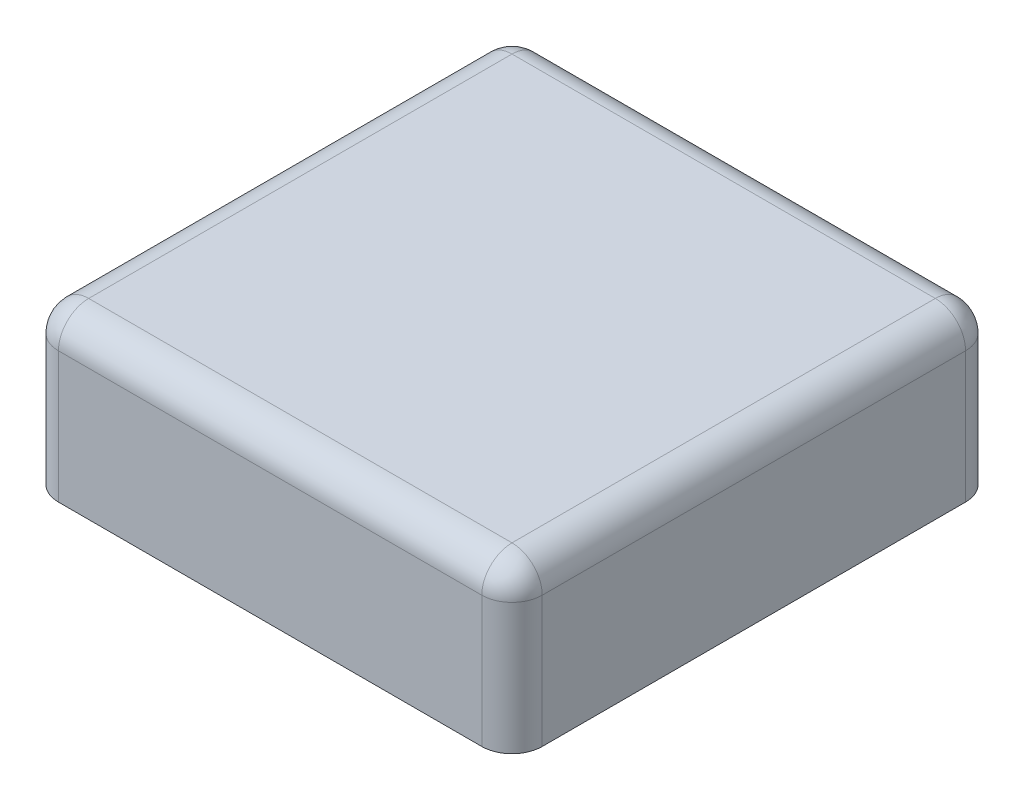
ISO-10303-21;
HEADER;
FILE_DESCRIPTION(('STEP AP214'),'2;1');
FILE_NAME('part.step','',(''),(''),'','','');
FILE_SCHEMA(('AUTOMOTIVE_DESIGN { 1 0 10303 214 1 1 1 1 }'));
ENDSEC;
DATA;
#1=APPLICATION_CONTEXT('core data for automotive mechanical design processes');
#2=APPLICATION_PROTOCOL_DEFINITION('international standard','automotive_design',2000,#1);
#3=PRODUCT_CONTEXT('',#1,'mechanical');
#4=PRODUCT('Part','Part','',(#3));
#5=PRODUCT_RELATED_PRODUCT_CATEGORY('part','',(#4));
#6=PRODUCT_DEFINITION_FORMATION('','',#4);
#7=PRODUCT_DEFINITION_CONTEXT('part definition',#1,'design');
#8=PRODUCT_DEFINITION('design','',#6,#7);
#9=PRODUCT_DEFINITION_SHAPE('','',#8);
#10=(LENGTH_UNIT() NAMED_UNIT(*) SI_UNIT(.MILLI.,.METRE.));
#11=(NAMED_UNIT(*) PLANE_ANGLE_UNIT() SI_UNIT($,.RADIAN.));
#12=(NAMED_UNIT(*) SI_UNIT($,.STERADIAN.) SOLID_ANGLE_UNIT());
#13=UNCERTAINTY_MEASURE_WITH_UNIT(LENGTH_MEASURE(1.E-05),#10,'distance_accuracy_value','');
#14=(GEOMETRIC_REPRESENTATION_CONTEXT(3) GLOBAL_UNCERTAINTY_ASSIGNED_CONTEXT((#13)) GLOBAL_UNIT_ASSIGNED_CONTEXT((#10,
#11,#12)) REPRESENTATION_CONTEXT('',''));
#15=CARTESIAN_POINT('',(0.,0.,0.));
#16=DIRECTION('',(0.,0.,1.));
#17=DIRECTION('',(1.,0.,0.));
#18=AXIS2_PLACEMENT_3D('',#15,#16,#17);
#19=CARTESIAN_POINT('',(-10.1341548762552,4.,-10.2951004081671));
#20=DIRECTION('',(1.,0.,0.));
#21=DIRECTION('',(0.,0.,-1.));
#22=AXIS2_PLACEMENT_3D('',#19,#20,#21);
#23=PLANE('',#22);
#24=DIRECTION('',(0.,0.,1.));
#25=VECTOR('',#24,1.);
#26=CARTESIAN_POINT('',(-10.1341548762552,0.,-10.2951004081671));
#27=LINE('',#26,#25);
#28=CARTESIAN_POINT('',(-10.1341548762552,0.,-9.54510040816707));
#29=VERTEX_POINT('',#28);
#30=CARTESIAN_POINT('',(-10.1341548762552,0.,0.954899591832928));
#31=VERTEX_POINT('',#30);
#32=EDGE_CURVE('E139',#29,#31,#27,.T.);
#33=ORIENTED_EDGE('',*,*,#32,.T.);
#34=DIRECTION('',(0.,-1.,0.));
#35=VECTOR('',#34,1.);
#36=CARTESIAN_POINT('',(-10.1341548762552,4.,0.954899591832928));
#37=LINE('',#36,#35);
#38=CARTESIAN_POINT('',(-10.1341548762552,3.25,0.954899591832929));
#39=VERTEX_POINT('',#38);
#40=EDGE_CURVE('E117',#31,#39,#37,.F.);
#41=ORIENTED_EDGE('',*,*,#40,.T.);
#42=DIRECTION('',(0.,0.,1.));
#43=VECTOR('',#42,1.);
#44=CARTESIAN_POINT('',(-10.1341548762552,3.25,-10.2951004081671));
#45=LINE('',#44,#43);
#46=CARTESIAN_POINT('',(-10.1341548762552,3.25,-9.54510040816707));
#47=VERTEX_POINT('',#46);
#48=EDGE_CURVE('E122',#39,#47,#45,.F.);
#49=ORIENTED_EDGE('',*,*,#48,.T.);
#50=DIRECTION('',(0.,-1.,0.));
#51=VECTOR('',#50,1.);
#52=CARTESIAN_POINT('',(-10.1341548762552,4.,-9.54510040816707));
#53=LINE('',#52,#51);
#54=EDGE_CURVE('E155',#47,#29,#53,.T.);
#55=ORIENTED_EDGE('',*,*,#54,.T.);
#56=EDGE_LOOP('',(#33,#41,#49,#55));
#57=FACE_BOUND('',#56,.T.);
#58=ADVANCED_FACE('F32',(#57),#23,.F.);
#59=CARTESIAN_POINT('',(-10.1341548762552,4.,1.70489959183293));
#60=DIRECTION('',(0.,0.,-1.));
#61=DIRECTION('',(-1.,0.,0.));
#62=AXIS2_PLACEMENT_3D('',#59,#60,#61);
#63=PLANE('',#62);
#64=DIRECTION('',(1.,0.,0.));
#65=VECTOR('',#64,1.);
#66=CARTESIAN_POINT('',(-10.1341548762552,3.25,1.70489959183293));
#67=LINE('',#66,#65);
#68=CARTESIAN_POINT('',(1.11584512374479,3.25,1.70489959183293));
#69=VERTEX_POINT('',#68);
#70=CARTESIAN_POINT('',(-9.38415487625521,3.25,1.70489959183293));
#71=VERTEX_POINT('',#70);
#72=EDGE_CURVE('E130',#69,#71,#67,.F.);
#73=ORIENTED_EDGE('',*,*,#72,.T.);
#74=DIRECTION('',(0.,-1.,0.));
#75=VECTOR('',#74,1.);
#76=CARTESIAN_POINT('',(-9.38415487625521,4.,1.70489959183293));
#77=LINE('',#76,#75);
#78=CARTESIAN_POINT('',(-9.38415487625521,0.,1.70489959183293));
#79=VERTEX_POINT('',#78);
#80=EDGE_CURVE('E116',#71,#79,#77,.T.);
#81=ORIENTED_EDGE('',*,*,#80,.T.);
#82=DIRECTION('',(1.,0.,0.));
#83=VECTOR('',#82,1.);
#84=CARTESIAN_POINT('',(-10.1341548762552,0.,1.70489959183293));
#85=LINE('',#84,#83);
#86=CARTESIAN_POINT('',(1.11584512374479,0.,1.70489959183293));
#87=VERTEX_POINT('',#86);
#88=EDGE_CURVE('E128',#79,#87,#85,.T.);
#89=ORIENTED_EDGE('',*,*,#88,.T.);
#90=DIRECTION('',(0.,-1.,0.));
#91=VECTOR('',#90,1.);
#92=CARTESIAN_POINT('',(1.11584512374479,4.,1.70489959183293));
#93=LINE('',#92,#91);
#94=EDGE_CURVE('E133',#87,#69,#93,.F.);
#95=ORIENTED_EDGE('',*,*,#94,.T.);
#96=EDGE_LOOP('',(#73,#81,#89,#95));
#97=FACE_BOUND('',#96,.T.);
#98=ADVANCED_FACE('F127',(#97),#63,.F.);
#99=CARTESIAN_POINT('',(1.86584512374478,4.,-10.2951004081671));
#100=DIRECTION('',(-1.,0.,0.));
#101=DIRECTION('',(0.,0.,1.));
#102=AXIS2_PLACEMENT_3D('',#99,#100,#101);
#103=PLANE('',#102);
#104=DIRECTION('',(0.,0.,-1.));
#105=VECTOR('',#104,1.);
#106=CARTESIAN_POINT('',(1.86584512374478,0.,-10.2951004081671));
#107=LINE('',#106,#105);
#108=CARTESIAN_POINT('',(1.86584512374479,0.,0.954899591832928));
#109=VERTEX_POINT('',#108);
#110=CARTESIAN_POINT('',(1.86584512374479,0.,-9.54510040816707));
#111=VERTEX_POINT('',#110);
#112=EDGE_CURVE('E138',#109,#111,#107,.T.);
#113=ORIENTED_EDGE('',*,*,#112,.T.);
#114=DIRECTION('',(0.,-1.,0.));
#115=VECTOR('',#114,1.);
#116=CARTESIAN_POINT('',(1.86584512374479,4.,-9.54510040816707));
#117=LINE('',#116,#115);
#118=CARTESIAN_POINT('',(1.86584512374479,3.25,-9.54510040816707));
#119=VERTEX_POINT('',#118);
#120=EDGE_CURVE('E168',#111,#119,#117,.F.);
#121=ORIENTED_EDGE('',*,*,#120,.T.);
#122=DIRECTION('',(0.,0.,-1.));
#123=VECTOR('',#122,1.);
#124=CARTESIAN_POINT('',(1.86584512374479,3.25,1.70489959183293));
#125=LINE('',#124,#123);
#126=CARTESIAN_POINT('',(1.86584512374479,3.25,0.954899591832928));
#127=VERTEX_POINT('',#126);
#128=EDGE_CURVE('E164',#119,#127,#125,.F.);
#129=ORIENTED_EDGE('',*,*,#128,.T.);
#130=DIRECTION('',(0.,-1.,0.));
#131=VECTOR('',#130,1.);
#132=CARTESIAN_POINT('',(1.86584512374479,4.,0.954899591832928));
#133=LINE('',#132,#131);
#134=EDGE_CURVE('E166',#127,#109,#133,.T.);
#135=ORIENTED_EDGE('',*,*,#134,.T.);
#136=EDGE_LOOP('',(#113,#121,#129,#135));
#137=FACE_BOUND('',#136,.T.);
#138=ADVANCED_FACE('F253',(#137),#103,.F.);
#139=CARTESIAN_POINT('',(-10.1341548762552,4.,-10.2951004081671));
#140=DIRECTION('',(0.,0.,1.));
#141=DIRECTION('',(1.,0.,0.));
#142=AXIS2_PLACEMENT_3D('',#139,#140,#141);
#143=PLANE('',#142);
#144=DIRECTION('',(-1.,0.,0.));
#145=VECTOR('',#144,1.);
#146=CARTESIAN_POINT('',(-10.1341548762552,0.,-10.2951004081671));
#147=LINE('',#146,#145);
#148=CARTESIAN_POINT('',(1.11584512374478,0.,-10.2951004081671));
#149=VERTEX_POINT('',#148);
#150=CARTESIAN_POINT('',(-9.38415487625521,0.,-10.2951004081671));
#151=VERTEX_POINT('',#150);
#152=EDGE_CURVE('E142',#149,#151,#147,.T.);
#153=ORIENTED_EDGE('',*,*,#152,.T.);
#154=DIRECTION('',(0.,-1.,0.));
#155=VECTOR('',#154,1.);
#156=CARTESIAN_POINT('',(-9.38415487625521,4.,-10.2951004081671));
#157=LINE('',#156,#155);
#158=CARTESIAN_POINT('',(-9.38415487625521,3.25,-10.2951004081671));
#159=VERTEX_POINT('',#158);
#160=EDGE_CURVE('E162',#151,#159,#157,.F.);
#161=ORIENTED_EDGE('',*,*,#160,.T.);
#162=DIRECTION('',(-1.,0.,0.));
#163=VECTOR('',#162,1.);
#164=CARTESIAN_POINT('',(1.86584512374478,3.25,-10.2951004081671));
#165=LINE('',#164,#163);
#166=CARTESIAN_POINT('',(1.11584512374478,3.25,-10.2951004081671));
#167=VERTEX_POINT('',#166);
#168=EDGE_CURVE('E158',#159,#167,#165,.F.);
#169=ORIENTED_EDGE('',*,*,#168,.T.);
#170=DIRECTION('',(0.,-1.,0.));
#171=VECTOR('',#170,1.);
#172=CARTESIAN_POINT('',(1.11584512374478,4.,-10.2951004081671));
#173=LINE('',#172,#171);
#174=EDGE_CURVE('E160',#167,#149,#173,.T.);
#175=ORIENTED_EDGE('',*,*,#174,.T.);
#176=EDGE_LOOP('',(#153,#161,#169,#175));
#177=FACE_BOUND('',#176,.T.);
#178=ADVANCED_FACE('F217',(#177),#143,.F.);
#179=CARTESIAN_POINT('',(-10.1341548762552,4.,1.70489959183293));
#180=DIRECTION('',(0.,1.,0.));
#181=DIRECTION('',(0.,0.,1.));
#182=AXIS2_PLACEMENT_3D('',#179,#180,#181);
#183=PLANE('',#182);
#184=DIRECTION('',(0.,0.,1.));
#185=VECTOR('',#184,1.);
#186=CARTESIAN_POINT('',(-9.38415487625521,4.,1.70489959183293));
#187=LINE('',#186,#185);
#188=CARTESIAN_POINT('',(-9.38415487625521,4.,-9.54510040816707));
#189=VERTEX_POINT('',#188);
#190=CARTESIAN_POINT('',(-9.38415487625521,4.,0.954899591832929));
#191=VERTEX_POINT('',#190);
#192=EDGE_CURVE('E170',#189,#191,#187,.T.);
#193=ORIENTED_EDGE('',*,*,#192,.T.);
#194=DIRECTION('',(1.,0.,0.));
#195=VECTOR('',#194,1.);
#196=CARTESIAN_POINT('',(1.86584512374479,4.,0.954899591832929));
#197=LINE('',#196,#195);
#198=CARTESIAN_POINT('',(1.11584512374479,4.,0.954899591832929));
#199=VERTEX_POINT('',#198);
#200=EDGE_CURVE('E11',#191,#199,#197,.T.);
#201=ORIENTED_EDGE('',*,*,#200,.T.);
#202=DIRECTION('',(0.,0.,-1.));
#203=VECTOR('',#202,1.);
#204=CARTESIAN_POINT('',(1.11584512374478,4.,-10.2951004081671));
#205=LINE('',#204,#203);
#206=CARTESIAN_POINT('',(1.11584512374478,4.,-9.54510040816707));
#207=VERTEX_POINT('',#206);
#208=EDGE_CURVE('E41',#199,#207,#205,.T.);
#209=ORIENTED_EDGE('',*,*,#208,.T.);
#210=DIRECTION('',(-1.,0.,0.));
#211=VECTOR('',#210,1.);
#212=CARTESIAN_POINT('',(-10.1341548762552,4.,-9.54510040816707));
#213=LINE('',#212,#211);
#214=EDGE_CURVE('E172',#207,#189,#213,.T.);
#215=ORIENTED_EDGE('',*,*,#214,.T.);
#216=EDGE_LOOP('',(#193,#201,#209,#215));
#217=FACE_BOUND('',#216,.T.);
#218=ADVANCED_FACE('F234',(#217),#183,.T.);
#219=CARTESIAN_POINT('',(-10.1341548762552,0.,1.70489959183293));
#220=DIRECTION('',(0.,1.,0.));
#221=DIRECTION('',(0.,0.,1.));
#222=AXIS2_PLACEMENT_3D('',#219,#220,#221);
#223=PLANE('',#222);
#224=ORIENTED_EDGE('',*,*,#88,.F.);
#225=CARTESIAN_POINT('',(-9.38415487625521,0.,0.954899591832929));
#226=DIRECTION('',(0.,1.,0.));
#227=DIRECTION('',(0.,0.,1.));
#228=AXIS2_PLACEMENT_3D('',#225,#226,#227);
#229=CIRCLE('',#228,0.75);
#230=EDGE_CURVE('E112',#79,#31,#229,.F.);
#231=ORIENTED_EDGE('',*,*,#230,.T.);
#232=ORIENTED_EDGE('',*,*,#32,.F.);
#233=CARTESIAN_POINT('',(-9.38415487625521,0.,-9.54510040816707));
#234=DIRECTION('',(0.,1.,0.));
#235=DIRECTION('',(0.,0.,1.));
#236=AXIS2_PLACEMENT_3D('',#233,#234,#235);
#237=CIRCLE('',#236,0.75);
#238=EDGE_CURVE('E123',#29,#151,#237,.F.);
#239=ORIENTED_EDGE('',*,*,#238,.T.);
#240=ORIENTED_EDGE('',*,*,#152,.F.);
#241=CARTESIAN_POINT('',(1.11584512374478,0.,-9.54510040816707));
#242=DIRECTION('',(0.,1.,0.));
#243=DIRECTION('',(0.,0.,1.));
#244=AXIS2_PLACEMENT_3D('',#241,#242,#243);
#245=CIRCLE('',#244,0.75);
#246=EDGE_CURVE('E151',#149,#111,#245,.F.);
#247=ORIENTED_EDGE('',*,*,#246,.T.);
#248=ORIENTED_EDGE('',*,*,#112,.F.);
#249=CARTESIAN_POINT('',(1.11584512374479,0.,0.954899591832928));
#250=DIRECTION('',(0.,1.,0.));
#251=DIRECTION('',(0.,0.,1.));
#252=AXIS2_PLACEMENT_3D('',#249,#250,#251);
#253=CIRCLE('',#252,0.75);
#254=EDGE_CURVE('E132',#109,#87,#253,.F.);
#255=ORIENTED_EDGE('',*,*,#254,.T.);
#256=EDGE_LOOP('',(#224,#231,#232,#239,#240,#247,#248,#255));
#257=FACE_BOUND('',#256,.T.);
#258=ADVANCED_FACE('F135',(#257),#223,.F.);
#259=CARTESIAN_POINT('',(1.11584512374478,4.,-9.54510040816707));
#260=DIRECTION('',(0.,-1.,0.));
#261=DIRECTION('',(0.,0.,-1.));
#262=AXIS2_PLACEMENT_3D('',#259,#260,#261);
#263=CYLINDRICAL_SURFACE('',#262,0.75);
#264=CARTESIAN_POINT('',(1.11584512374479,3.25,-9.54510040816707));
#265=DIRECTION('',(0.,1.,0.));
#266=DIRECTION('',(0.,0.,1.));
#267=AXIS2_PLACEMENT_3D('',#264,#265,#266);
#268=CIRCLE('',#267,0.75);
#269=EDGE_CURVE('E36',#119,#167,#268,.T.);
#270=ORIENTED_EDGE('',*,*,#269,.F.);
#271=ORIENTED_EDGE('',*,*,#120,.F.);
#272=ORIENTED_EDGE('',*,*,#246,.F.);
#273=ORIENTED_EDGE('',*,*,#174,.F.);
#274=EDGE_LOOP('',(#270,#271,#272,#273));
#275=FACE_BOUND('',#274,.T.);
#276=ADVANCED_FACE('F34',(#275),#263,.T.);
#277=CARTESIAN_POINT('',(1.11584512374479,3.25,-9.54510040816707));
#278=DIRECTION('',(0.,0.,1.));
#279=DIRECTION('',(1.,0.,0.));
#280=AXIS2_PLACEMENT_3D('',#277,#278,#279);
#281=SPHERICAL_SURFACE('',#280,0.75);
#282=CARTESIAN_POINT('',(1.11584512374478,3.25,-9.54510040816707));
#283=DIRECTION('',(0.,0.,-1.));
#284=DIRECTION('',(-1.,0.,0.));
#285=AXIS2_PLACEMENT_3D('',#282,#283,#284);
#286=CIRCLE('',#285,0.75);
#287=EDGE_CURVE('E198',#119,#207,#286,.F.);
#288=ORIENTED_EDGE('',*,*,#287,.F.);
#289=ORIENTED_EDGE('',*,*,#269,.T.);
#290=CARTESIAN_POINT('',(1.11584512374478,3.25,-9.54510040816707));
#291=DIRECTION('',(1.,0.,0.));
#292=DIRECTION('',(0.,1.,0.));
#293=AXIS2_PLACEMENT_3D('',#290,#291,#292);
#294=CIRCLE('',#293,0.75);
#295=EDGE_CURVE('E199',#207,#167,#294,.F.);
#296=ORIENTED_EDGE('',*,*,#295,.F.);
#297=EDGE_LOOP('',(#288,#289,#296));
#298=FACE_BOUND('',#297,.T.);
#299=ADVANCED_FACE('F209',(#298),#281,.T.);
#300=CARTESIAN_POINT('',(-9.38415487625521,4.,-9.54510040816707));
#301=DIRECTION('',(0.,-1.,0.));
#302=DIRECTION('',(0.,0.,-1.));
#303=AXIS2_PLACEMENT_3D('',#300,#301,#302);
#304=CYLINDRICAL_SURFACE('',#303,0.75);
#305=ORIENTED_EDGE('',*,*,#238,.F.);
#306=ORIENTED_EDGE('',*,*,#54,.F.);
#307=CARTESIAN_POINT('',(-9.38415487625521,3.25,-9.54510040816707));
#308=DIRECTION('',(0.,1.,0.));
#309=DIRECTION('',(0.,0.,1.));
#310=AXIS2_PLACEMENT_3D('',#307,#308,#309);
#311=CIRCLE('',#310,0.75);
#312=EDGE_CURVE('E195',#159,#47,#311,.T.);
#313=ORIENTED_EDGE('',*,*,#312,.F.);
#314=ORIENTED_EDGE('',*,*,#160,.F.);
#315=EDGE_LOOP('',(#305,#306,#313,#314));
#316=FACE_BOUND('',#315,.T.);
#317=ADVANCED_FACE('F222',(#316),#304,.T.);
#318=CARTESIAN_POINT('',(-10.1341548762552,3.25,-9.54510040816707));
#319=DIRECTION('',(1.,0.,0.));
#320=DIRECTION('',(0.,0.,-1.));
#321=AXIS2_PLACEMENT_3D('',#318,#319,#320);
#322=CYLINDRICAL_SURFACE('',#321,0.75);
#323=ORIENTED_EDGE('',*,*,#295,.T.);
#324=ORIENTED_EDGE('',*,*,#168,.F.);
#325=CARTESIAN_POINT('',(-9.38415487625521,3.25,-9.54510040816707));
#326=DIRECTION('',(-1.,0.,0.));
#327=DIRECTION('',(0.,0.,1.));
#328=AXIS2_PLACEMENT_3D('',#325,#326,#327);
#329=CIRCLE('',#328,0.75);
#330=EDGE_CURVE('E192',#189,#159,#329,.T.);
#331=ORIENTED_EDGE('',*,*,#330,.F.);
#332=ORIENTED_EDGE('',*,*,#214,.F.);
#333=EDGE_LOOP('',(#323,#324,#331,#332));
#334=FACE_BOUND('',#333,.T.);
#335=ADVANCED_FACE('F225',(#334),#322,.T.);
#336=CARTESIAN_POINT('',(1.11584512374479,3.25,1.70489959183293));
#337=DIRECTION('',(0.,0.,1.));
#338=DIRECTION('',(1.,0.,0.));
#339=AXIS2_PLACEMENT_3D('',#336,#337,#338);
#340=CYLINDRICAL_SURFACE('',#339,0.75);
#341=ORIENTED_EDGE('',*,*,#287,.T.);
#342=ORIENTED_EDGE('',*,*,#208,.F.);
#343=CARTESIAN_POINT('',(1.11584512374479,3.25,0.954899591832928));
#344=DIRECTION('',(0.,0.,1.));
#345=DIRECTION('',(0.,-1.,0.));
#346=AXIS2_PLACEMENT_3D('',#343,#344,#345);
#347=CIRCLE('',#346,0.75);
#348=EDGE_CURVE('E190',#127,#199,#347,.T.);
#349=ORIENTED_EDGE('',*,*,#348,.F.);
#350=ORIENTED_EDGE('',*,*,#128,.F.);
#351=EDGE_LOOP('',(#341,#342,#349,#350));
#352=FACE_BOUND('',#351,.T.);
#353=ADVANCED_FACE('F294',(#352),#340,.T.);
#354=CARTESIAN_POINT('',(1.11584512374479,4.,0.954899591832928));
#355=DIRECTION('',(0.,-1.,0.));
#356=DIRECTION('',(0.,0.,-1.));
#357=AXIS2_PLACEMENT_3D('',#354,#355,#356);
#358=CYLINDRICAL_SURFACE('',#357,0.75);
#359=ORIENTED_EDGE('',*,*,#254,.F.);
#360=ORIENTED_EDGE('',*,*,#134,.F.);
#361=CARTESIAN_POINT('',(1.11584512374479,3.25,0.954899591832929));
#362=DIRECTION('',(0.,1.,0.));
#363=DIRECTION('',(0.,0.,1.));
#364=AXIS2_PLACEMENT_3D('',#361,#362,#363);
#365=CIRCLE('',#364,0.75);
#366=EDGE_CURVE('E187',#69,#127,#365,.T.);
#367=ORIENTED_EDGE('',*,*,#366,.F.);
#368=ORIENTED_EDGE('',*,*,#94,.F.);
#369=EDGE_LOOP('',(#359,#360,#367,#368));
#370=FACE_BOUND('',#369,.T.);
#371=ADVANCED_FACE('F301',(#370),#358,.T.);
#372=CARTESIAN_POINT('',(-9.38415487625521,3.25,-9.54510040816707));
#373=DIRECTION('',(0.,0.,1.));
#374=DIRECTION('',(1.,0.,0.));
#375=AXIS2_PLACEMENT_3D('',#372,#373,#374);
#376=SPHERICAL_SURFACE('',#375,0.75);
#377=ORIENTED_EDGE('',*,*,#330,.T.);
#378=ORIENTED_EDGE('',*,*,#312,.T.);
#379=CARTESIAN_POINT('',(-9.38415487625521,3.25,-9.54510040816707));
#380=DIRECTION('',(0.,0.,-1.));
#381=DIRECTION('',(-1.,0.,0.));
#382=AXIS2_PLACEMENT_3D('',#379,#380,#381);
#383=CIRCLE('',#382,0.75);
#384=EDGE_CURVE('E184',#189,#47,#383,.F.);
#385=ORIENTED_EDGE('',*,*,#384,.F.);
#386=EDGE_LOOP('',(#377,#378,#385));
#387=FACE_BOUND('',#386,.T.);
#388=ADVANCED_FACE('F229',(#387),#376,.T.);
#389=CARTESIAN_POINT('',(1.11584512374479,3.25,0.954899591832929));
#390=DIRECTION('',(0.,0.,1.));
#391=DIRECTION('',(1.,0.,0.));
#392=AXIS2_PLACEMENT_3D('',#389,#390,#391);
#393=SPHERICAL_SURFACE('',#392,0.75);
#394=ORIENTED_EDGE('',*,*,#366,.T.);
#395=ORIENTED_EDGE('',*,*,#348,.T.);
#396=CARTESIAN_POINT('',(1.11584512374479,3.25,0.954899591832929));
#397=DIRECTION('',(1.,0.,0.));
#398=DIRECTION('',(0.,0.,-1.));
#399=AXIS2_PLACEMENT_3D('',#396,#397,#398);
#400=CIRCLE('',#399,0.75);
#401=EDGE_CURVE('E49',#69,#199,#400,.F.);
#402=ORIENTED_EDGE('',*,*,#401,.F.);
#403=EDGE_LOOP('',(#394,#395,#402));
#404=FACE_BOUND('',#403,.T.);
#405=ADVANCED_FACE('F316',(#404),#393,.T.);
#406=CARTESIAN_POINT('',(-9.38415487625521,3.25,1.70489959183293));
#407=DIRECTION('',(0.,0.,-1.));
#408=DIRECTION('',(-1.,0.,0.));
#409=AXIS2_PLACEMENT_3D('',#406,#407,#408);
#410=CYLINDRICAL_SURFACE('',#409,0.75);
#411=ORIENTED_EDGE('',*,*,#384,.T.);
#412=ORIENTED_EDGE('',*,*,#48,.F.);
#413=CARTESIAN_POINT('',(-9.38415487625521,3.25,0.954899591832929));
#414=DIRECTION('',(0.,0.,1.));
#415=DIRECTION('',(1.,0.,0.));
#416=AXIS2_PLACEMENT_3D('',#413,#414,#415);
#417=CIRCLE('',#416,0.75);
#418=EDGE_CURVE('E180',#191,#39,#417,.T.);
#419=ORIENTED_EDGE('',*,*,#418,.F.);
#420=ORIENTED_EDGE('',*,*,#192,.F.);
#421=EDGE_LOOP('',(#411,#412,#419,#420));
#422=FACE_BOUND('',#421,.T.);
#423=ADVANCED_FACE('F233',(#422),#410,.T.);
#424=CARTESIAN_POINT('',(-10.1341548762552,3.25,0.954899591832929));
#425=DIRECTION('',(-1.,0.,0.));
#426=DIRECTION('',(0.,0.,1.));
#427=AXIS2_PLACEMENT_3D('',#424,#425,#426);
#428=CYLINDRICAL_SURFACE('',#427,0.75);
#429=ORIENTED_EDGE('',*,*,#401,.T.);
#430=ORIENTED_EDGE('',*,*,#200,.F.);
#431=CARTESIAN_POINT('',(-9.38415487625521,3.25,0.954899591832929));
#432=DIRECTION('',(-1.,0.,0.));
#433=DIRECTION('',(0.,0.,1.));
#434=AXIS2_PLACEMENT_3D('',#431,#432,#433);
#435=CIRCLE('',#434,0.75);
#436=EDGE_CURVE('E177',#71,#191,#435,.T.);
#437=ORIENTED_EDGE('',*,*,#436,.F.);
#438=ORIENTED_EDGE('',*,*,#72,.F.);
#439=EDGE_LOOP('',(#429,#430,#437,#438));
#440=FACE_BOUND('',#439,.T.);
#441=ADVANCED_FACE('F235',(#440),#428,.T.);
#442=CARTESIAN_POINT('',(-9.38415487625521,3.25,0.954899591832929));
#443=DIRECTION('',(0.,0.,1.));
#444=DIRECTION('',(1.,0.,0.));
#445=AXIS2_PLACEMENT_3D('',#442,#443,#444);
#446=SPHERICAL_SURFACE('',#445,0.75);
#447=ORIENTED_EDGE('',*,*,#436,.T.);
#448=ORIENTED_EDGE('',*,*,#418,.T.);
#449=CARTESIAN_POINT('',(-9.38415487625521,3.25,0.954899591832929));
#450=DIRECTION('',(0.,1.,0.));
#451=DIRECTION('',(0.,0.,1.));
#452=AXIS2_PLACEMENT_3D('',#449,#450,#451);
#453=CIRCLE('',#452,0.75);
#454=EDGE_CURVE('E175',#71,#39,#453,.F.);
#455=ORIENTED_EDGE('',*,*,#454,.F.);
#456=EDGE_LOOP('',(#447,#448,#455));
#457=FACE_BOUND('',#456,.T.);
#458=ADVANCED_FACE('F238',(#457),#446,.T.);
#459=CARTESIAN_POINT('',(-9.38415487625521,4.,0.954899591832929));
#460=DIRECTION('',(0.,-1.,0.));
#461=DIRECTION('',(0.,0.,-1.));
#462=AXIS2_PLACEMENT_3D('',#459,#460,#461);
#463=CYLINDRICAL_SURFACE('',#462,0.75);
#464=ORIENTED_EDGE('',*,*,#454,.T.);
#465=ORIENTED_EDGE('',*,*,#40,.F.);
#466=ORIENTED_EDGE('',*,*,#230,.F.);
#467=ORIENTED_EDGE('',*,*,#80,.F.);
#468=EDGE_LOOP('',(#464,#465,#466,#467));
#469=FACE_BOUND('',#468,.T.);
#470=ADVANCED_FACE('F115',(#469),#463,.T.);
#471=CLOSED_SHELL('',(#58,#98,#138,#178,#218,#258,#276,#299,#317,#335,#353,#371,#388,#405,#423,
#441,#458,#470));
#472=MANIFOLD_SOLID_BREP('B2',#471);
#473=ADVANCED_BREP_SHAPE_REPRESENTATION('',(#18,#472),#14);
#474=SHAPE_DEFINITION_REPRESENTATION(#9,#473);
ENDSEC;
END-ISO-10303-21;
